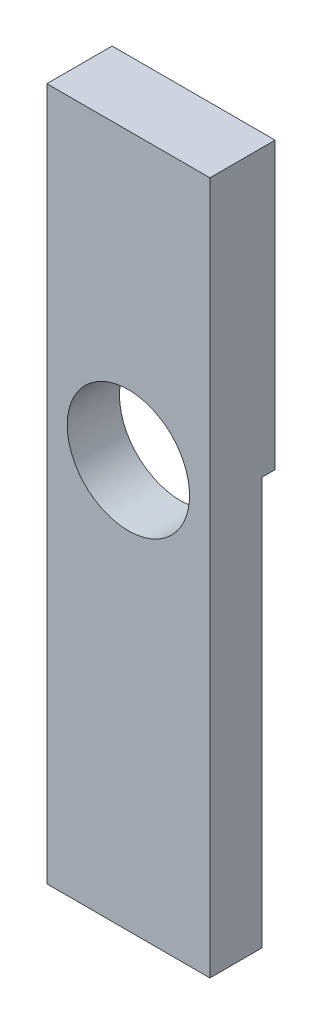
ISO-10303-21;
HEADER;
FILE_DESCRIPTION(('STEP AP214'),'2;1');
FILE_NAME('part.step','',(''),(''),'','','');
FILE_SCHEMA(('AUTOMOTIVE_DESIGN { 1 0 10303 214 1 1 1 1 }'));
ENDSEC;
DATA;
#1=APPLICATION_CONTEXT('core data for automotive mechanical design processes');
#2=APPLICATION_PROTOCOL_DEFINITION('international standard','automotive_design',2000,#1);
#3=PRODUCT_CONTEXT('',#1,'mechanical');
#4=PRODUCT('Part','Part','',(#3));
#5=PRODUCT_RELATED_PRODUCT_CATEGORY('part','',(#4));
#6=PRODUCT_DEFINITION_FORMATION('','',#4);
#7=PRODUCT_DEFINITION_CONTEXT('part definition',#1,'design');
#8=PRODUCT_DEFINITION('design','',#6,#7);
#9=PRODUCT_DEFINITION_SHAPE('','',#8);
#10=(LENGTH_UNIT() NAMED_UNIT(*) SI_UNIT(.MILLI.,.METRE.));
#11=(NAMED_UNIT(*) PLANE_ANGLE_UNIT() SI_UNIT($,.RADIAN.));
#12=(NAMED_UNIT(*) SI_UNIT($,.STERADIAN.) SOLID_ANGLE_UNIT());
#13=UNCERTAINTY_MEASURE_WITH_UNIT(LENGTH_MEASURE(1.E-05),#10,'distance_accuracy_value','');
#14=(GEOMETRIC_REPRESENTATION_CONTEXT(3) GLOBAL_UNCERTAINTY_ASSIGNED_CONTEXT((#13)) GLOBAL_UNIT_ASSIGNED_CONTEXT((#10,
#11,#12)) REPRESENTATION_CONTEXT('',''));
#15=CARTESIAN_POINT('',(0.,0.,0.));
#16=DIRECTION('',(0.,0.,1.));
#17=DIRECTION('',(1.,0.,0.));
#18=AXIS2_PLACEMENT_3D('',#15,#16,#17);
#19=CARTESIAN_POINT('',(-6.35000000000001,53.975,5.08));
#20=DIRECTION('',(0.,-1.,0.));
#21=DIRECTION('',(0.,0.,-1.));
#22=AXIS2_PLACEMENT_3D('',#19,#20,#21);
#23=PLANE('',#22);
#24=DIRECTION('',(-1.,0.,0.));
#25=VECTOR('',#24,1.);
#26=CARTESIAN_POINT('',(-6.35000000000001,53.975,0.));
#27=LINE('',#26,#25);
#28=CARTESIAN_POINT('',(6.34999999999999,53.975,0.));
#29=VERTEX_POINT('',#28);
#30=CARTESIAN_POINT('',(-6.35000000000001,53.975,0.));
#31=VERTEX_POINT('',#30);
#32=EDGE_CURVE('E128',#29,#31,#27,.T.);
#33=ORIENTED_EDGE('',*,*,#32,.T.);
#34=DIRECTION('',(0.,0.,-1.));
#35=VECTOR('',#34,1.);
#36=CARTESIAN_POINT('',(-6.35000000000001,53.975,5.08));
#37=LINE('',#36,#35);
#38=CARTESIAN_POINT('',(-6.35000000000001,53.975,5.08));
#39=VERTEX_POINT('',#38);
#40=EDGE_CURVE('E45',#39,#31,#37,.T.);
#41=ORIENTED_EDGE('',*,*,#40,.F.);
#42=DIRECTION('',(-1.,0.,0.));
#43=VECTOR('',#42,1.);
#44=CARTESIAN_POINT('',(-6.35000000000001,53.975,5.08));
#45=LINE('',#44,#43);
#46=CARTESIAN_POINT('',(6.34999999999999,53.975,5.08));
#47=VERTEX_POINT('',#46);
#48=EDGE_CURVE('E127',#47,#39,#45,.T.);
#49=ORIENTED_EDGE('',*,*,#48,.F.);
#50=DIRECTION('',(0.,0.,-1.));
#51=VECTOR('',#50,1.);
#52=CARTESIAN_POINT('',(6.34999999999999,53.975,5.08));
#53=LINE('',#52,#51);
#54=EDGE_CURVE('E120',#47,#29,#53,.T.);
#55=ORIENTED_EDGE('',*,*,#54,.T.);
#56=EDGE_LOOP('',(#33,#41,#49,#55));
#57=FACE_BOUND('',#56,.T.);
#58=ADVANCED_FACE('F39',(#57),#23,.F.);
#59=CARTESIAN_POINT('',(-6.35000000000001,53.975,5.08));
#60=DIRECTION('',(1.,0.,0.));
#61=DIRECTION('',(0.,1.,0.));
#62=AXIS2_PLACEMENT_3D('',#59,#60,#61);
#63=PLANE('',#62);
#64=DIRECTION('',(0.,0.,-1.));
#65=VECTOR('',#64,1.);
#66=CARTESIAN_POINT('',(-6.35000000000002,31.75,1.016));
#67=LINE('',#66,#65);
#68=CARTESIAN_POINT('',(-6.35000000000002,31.75,1.016));
#69=VERTEX_POINT('',#68);
#70=CARTESIAN_POINT('',(-6.35000000000002,31.75,0.));
#71=VERTEX_POINT('',#70);
#72=EDGE_CURVE('E106',#69,#71,#67,.T.);
#73=ORIENTED_EDGE('',*,*,#72,.F.);
#74=DIRECTION('',(0.,-1.,0.));
#75=VECTOR('',#74,1.);
#76=CARTESIAN_POINT('',(-6.35000000000001,-31.75,1.016));
#77=LINE('',#76,#75);
#78=CARTESIAN_POINT('',(-6.35000000000002,0.,1.016));
#79=VERTEX_POINT('',#78);
#80=EDGE_CURVE('E109',#69,#79,#77,.T.);
#81=ORIENTED_EDGE('',*,*,#80,.T.);
#82=DIRECTION('',(0.,0.,-1.));
#83=VECTOR('',#82,1.);
#84=CARTESIAN_POINT('',(-6.35,0.,5.08));
#85=LINE('',#84,#83);
#86=CARTESIAN_POINT('',(-6.35,0.,5.08));
#87=VERTEX_POINT('',#86);
#88=EDGE_CURVE('E118',#87,#79,#85,.T.);
#89=ORIENTED_EDGE('',*,*,#88,.F.);
#90=DIRECTION('',(0.,-1.,0.));
#91=VECTOR('',#90,1.);
#92=CARTESIAN_POINT('',(-6.35000000000001,53.975,5.08));
#93=LINE('',#92,#91);
#94=EDGE_CURVE('E81',#39,#87,#93,.T.);
#95=ORIENTED_EDGE('',*,*,#94,.F.);
#96=ORIENTED_EDGE('',*,*,#40,.T.);
#97=DIRECTION('',(0.,-1.,0.));
#98=VECTOR('',#97,1.);
#99=CARTESIAN_POINT('',(-6.35000000000001,53.975,0.));
#100=LINE('',#99,#98);
#101=EDGE_CURVE('E130',#31,#71,#100,.T.);
#102=ORIENTED_EDGE('',*,*,#101,.T.);
#103=EDGE_LOOP('',(#73,#81,#89,#95,#96,#102));
#104=FACE_BOUND('',#103,.T.);
#105=ADVANCED_FACE('F166',(#104),#63,.F.);
#106=CARTESIAN_POINT('',(-6.35,0.,5.08));
#107=DIRECTION('',(0.,1.,0.));
#108=DIRECTION('',(0.,0.,1.));
#109=AXIS2_PLACEMENT_3D('',#106,#107,#108);
#110=PLANE('',#109);
#111=ORIENTED_EDGE('',*,*,#88,.T.);
#112=DIRECTION('',(1.,0.,0.));
#113=VECTOR('',#112,1.);
#114=CARTESIAN_POINT('',(-6.35,0.,1.016));
#115=LINE('',#114,#113);
#116=CARTESIAN_POINT('',(6.35,0.,1.016));
#117=VERTEX_POINT('',#116);
#118=EDGE_CURVE('E104',#79,#117,#115,.T.);
#119=ORIENTED_EDGE('',*,*,#118,.T.);
#120=DIRECTION('',(0.,0.,-1.));
#121=VECTOR('',#120,1.);
#122=CARTESIAN_POINT('',(6.35,0.,5.08));
#123=LINE('',#122,#121);
#124=CARTESIAN_POINT('',(6.35,0.,5.08));
#125=VERTEX_POINT('',#124);
#126=EDGE_CURVE('E116',#125,#117,#123,.T.);
#127=ORIENTED_EDGE('',*,*,#126,.F.);
#128=DIRECTION('',(1.,0.,0.));
#129=VECTOR('',#128,1.);
#130=CARTESIAN_POINT('',(-6.35,0.,5.08));
#131=LINE('',#130,#129);
#132=EDGE_CURVE('E133',#87,#125,#131,.T.);
#133=ORIENTED_EDGE('',*,*,#132,.F.);
#134=EDGE_LOOP('',(#111,#119,#127,#133));
#135=FACE_BOUND('',#134,.T.);
#136=ADVANCED_FACE('F173',(#135),#110,.F.);
#137=CARTESIAN_POINT('',(6.34999999999999,53.975,5.08));
#138=DIRECTION('',(-1.,0.,0.));
#139=DIRECTION('',(0.,-1.,0.));
#140=AXIS2_PLACEMENT_3D('',#137,#138,#139);
#141=PLANE('',#140);
#142=DIRECTION('',(0.,1.,0.));
#143=VECTOR('',#142,1.);
#144=CARTESIAN_POINT('',(6.35000000000003,-31.75,1.016));
#145=LINE('',#144,#143);
#146=CARTESIAN_POINT('',(6.35000000000001,31.75,1.016));
#147=VERTEX_POINT('',#146);
#148=EDGE_CURVE('E11',#117,#147,#145,.T.);
#149=ORIENTED_EDGE('',*,*,#148,.T.);
#150=DIRECTION('',(0.,0.,-1.));
#151=VECTOR('',#150,1.);
#152=CARTESIAN_POINT('',(6.35000000000001,31.75,1.016));
#153=LINE('',#152,#151);
#154=CARTESIAN_POINT('',(6.35000000000001,31.75,0.));
#155=VERTEX_POINT('',#154);
#156=EDGE_CURVE('E97',#147,#155,#153,.T.);
#157=ORIENTED_EDGE('',*,*,#156,.T.);
#158=DIRECTION('',(0.,1.,0.));
#159=VECTOR('',#158,1.);
#160=CARTESIAN_POINT('',(6.34999999999999,53.975,0.));
#161=LINE('',#160,#159);
#162=EDGE_CURVE('E76',#155,#29,#161,.T.);
#163=ORIENTED_EDGE('',*,*,#162,.T.);
#164=ORIENTED_EDGE('',*,*,#54,.F.);
#165=DIRECTION('',(0.,1.,0.));
#166=VECTOR('',#165,1.);
#167=CARTESIAN_POINT('',(6.34999999999999,53.975,5.08));
#168=LINE('',#167,#166);
#169=EDGE_CURVE('E61',#125,#47,#168,.T.);
#170=ORIENTED_EDGE('',*,*,#169,.F.);
#171=ORIENTED_EDGE('',*,*,#126,.T.);
#172=EDGE_LOOP('',(#149,#157,#163,#164,#170,#171));
#173=FACE_BOUND('',#172,.T.);
#174=ADVANCED_FACE('F111',(#173),#141,.F.);
#175=CARTESIAN_POINT('',(0.,0.,5.08));
#176=DIRECTION('',(0.,0.,-1.));
#177=DIRECTION('',(-1.,0.,0.));
#178=AXIS2_PLACEMENT_3D('',#175,#176,#177);
#179=PLANE('',#178);
#180=CARTESIAN_POINT('',(0.,31.75,5.08));
#181=DIRECTION('',(0.,0.,-1.));
#182=DIRECTION('',(-1.,0.,0.));
#183=AXIS2_PLACEMENT_3D('',#180,#181,#182);
#184=CIRCLE('',#183,4.7625);
#185=CARTESIAN_POINT('',(-4.76250000000001,31.75,5.08));
#186=VERTEX_POINT('',#185);
#187=EDGE_CURVE('E143',#186,#186,#184,.T.);
#188=ORIENTED_EDGE('',*,*,#187,.T.);
#189=EDGE_LOOP('',(#188));
#190=FACE_BOUND('',#189,.T.);
#191=ORIENTED_EDGE('',*,*,#48,.T.);
#192=ORIENTED_EDGE('',*,*,#94,.T.);
#193=ORIENTED_EDGE('',*,*,#132,.T.);
#194=ORIENTED_EDGE('',*,*,#169,.T.);
#195=EDGE_LOOP('',(#191,#192,#193,#194));
#196=FACE_BOUND('',#195,.T.);
#197=ADVANCED_FACE('F149',(#190,#196),#179,.F.);
#198=CARTESIAN_POINT('',(0.,0.,0.));
#199=DIRECTION('',(0.,0.,-1.));
#200=DIRECTION('',(-1.,0.,0.));
#201=AXIS2_PLACEMENT_3D('',#198,#199,#200);
#202=PLANE('',#201);
#203=ORIENTED_EDGE('',*,*,#162,.F.);
#204=CARTESIAN_POINT('',(0.,31.75,0.));
#205=DIRECTION('',(0.,0.,1.));
#206=DIRECTION('',(1.,0.,0.));
#207=AXIS2_PLACEMENT_3D('',#204,#205,#206);
#208=CIRCLE('',#207,6.35000000000002);
#209=EDGE_CURVE('E102',#155,#71,#208,.T.);
#210=ORIENTED_EDGE('',*,*,#209,.T.);
#211=ORIENTED_EDGE('',*,*,#101,.F.);
#212=ORIENTED_EDGE('',*,*,#32,.F.);
#213=EDGE_LOOP('',(#203,#210,#211,#212));
#214=FACE_BOUND('',#213,.T.);
#215=ADVANCED_FACE('F158',(#214),#202,.T.);
#216=CARTESIAN_POINT('',(0.,-31.75,1.016));
#217=DIRECTION('',(0.,0.,1.));
#218=DIRECTION('',(1.,0.,0.));
#219=AXIS2_PLACEMENT_3D('',#216,#217,#218);
#220=PLANE('',#219);
#221=CARTESIAN_POINT('',(0.,31.75,1.016));
#222=DIRECTION('',(0.,0.,-1.));
#223=DIRECTION('',(-1.,0.,0.));
#224=AXIS2_PLACEMENT_3D('',#221,#222,#223);
#225=CIRCLE('',#224,4.7625);
#226=CARTESIAN_POINT('',(-4.76250000000001,31.75,1.016));
#227=VERTEX_POINT('',#226);
#228=EDGE_CURVE('E141',#227,#227,#225,.T.);
#229=ORIENTED_EDGE('',*,*,#228,.F.);
#230=EDGE_LOOP('',(#229));
#231=FACE_BOUND('',#230,.T.);
#232=ORIENTED_EDGE('',*,*,#80,.F.);
#233=CARTESIAN_POINT('',(0.,31.75,1.016));
#234=DIRECTION('',(0.,0.,1.));
#235=DIRECTION('',(1.,0.,0.));
#236=AXIS2_PLACEMENT_3D('',#233,#234,#235);
#237=CIRCLE('',#236,6.35000000000002);
#238=EDGE_CURVE('E101',#147,#69,#237,.T.);
#239=ORIENTED_EDGE('',*,*,#238,.F.);
#240=ORIENTED_EDGE('',*,*,#148,.F.);
#241=ORIENTED_EDGE('',*,*,#118,.F.);
#242=EDGE_LOOP('',(#232,#239,#240,#241));
#243=FACE_BOUND('',#242,.T.);
#244=ADVANCED_FACE('F107',(#231,#243),#220,.F.);
#245=CARTESIAN_POINT('',(0.,31.75,1.016));
#246=DIRECTION('',(0.,0.,-1.));
#247=DIRECTION('',(-1.,0.,0.));
#248=AXIS2_PLACEMENT_3D('',#245,#246,#247);
#249=CYLINDRICAL_SURFACE('',#248,6.35000000000002);
#250=ORIENTED_EDGE('',*,*,#209,.F.);
#251=ORIENTED_EDGE('',*,*,#156,.F.);
#252=ORIENTED_EDGE('',*,*,#238,.T.);
#253=ORIENTED_EDGE('',*,*,#72,.T.);
#254=EDGE_LOOP('',(#250,#251,#252,#253));
#255=FACE_BOUND('',#254,.T.);
#256=ADVANCED_FACE('F99',(#255),#249,.F.);
#257=CARTESIAN_POINT('',(0.,31.75,5.08));
#258=DIRECTION('',(0.,0.,-1.));
#259=DIRECTION('',(-1.,0.,0.));
#260=AXIS2_PLACEMENT_3D('',#257,#258,#259);
#261=CYLINDRICAL_SURFACE('',#260,4.7625);
#262=ORIENTED_EDGE('',*,*,#187,.F.);
#263=EDGE_LOOP('',(#262));
#264=FACE_BOUND('',#263,.T.);
#265=ORIENTED_EDGE('',*,*,#228,.T.);
#266=EDGE_LOOP('',(#265));
#267=FACE_BOUND('',#266,.T.);
#268=ADVANCED_FACE('F151',(#264,#267),#261,.F.);
#269=CLOSED_SHELL('',(#58,#105,#136,#174,#197,#215,#244,#256,#268));
#270=MANIFOLD_SOLID_BREP('B2',#269);
#271=ADVANCED_BREP_SHAPE_REPRESENTATION('',(#18,#270),#14);
#272=SHAPE_DEFINITION_REPRESENTATION(#9,#271);
ENDSEC;
END-ISO-10303-21;
